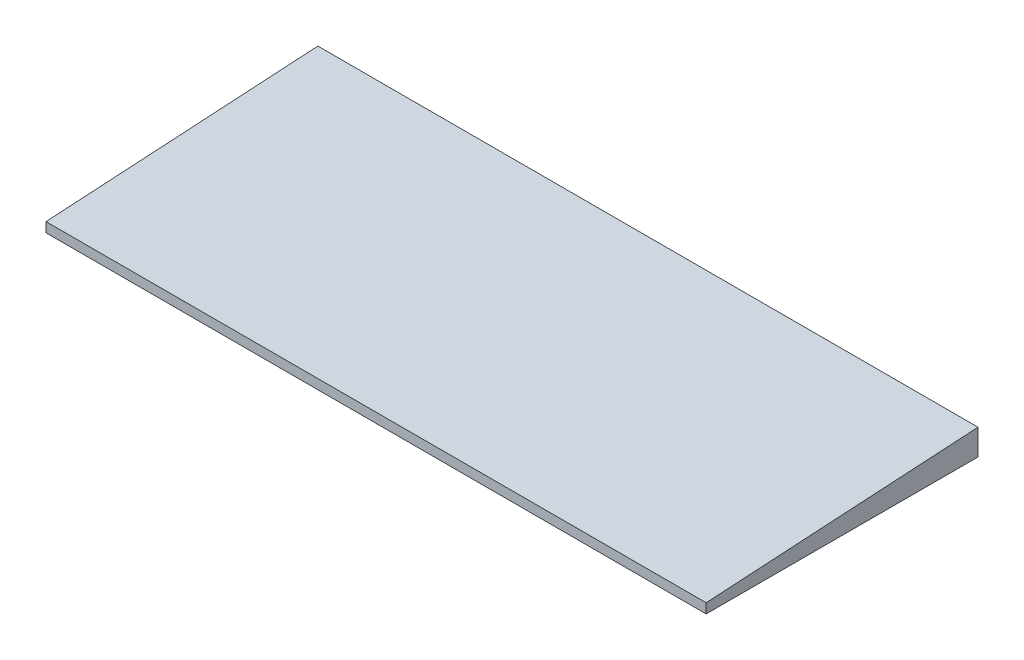
ISO-10303-21;
HEADER;
FILE_DESCRIPTION(('STEP AP214'),'2;1');
FILE_NAME('part.step','',(''),(''),'','','');
FILE_SCHEMA(('AUTOMOTIVE_DESIGN { 1 0 10303 214 1 1 1 1 }'));
ENDSEC;
DATA;
#1=APPLICATION_CONTEXT('core data for automotive mechanical design processes');
#2=APPLICATION_PROTOCOL_DEFINITION('international standard','automotive_design',2000,#1);
#3=PRODUCT_CONTEXT('',#1,'mechanical');
#4=PRODUCT('Part','Part','',(#3));
#5=PRODUCT_RELATED_PRODUCT_CATEGORY('part','',(#4));
#6=PRODUCT_DEFINITION_FORMATION('','',#4);
#7=PRODUCT_DEFINITION_CONTEXT('part definition',#1,'design');
#8=PRODUCT_DEFINITION('design','',#6,#7);
#9=PRODUCT_DEFINITION_SHAPE('','',#8);
#10=(LENGTH_UNIT() NAMED_UNIT(*) SI_UNIT(.MILLI.,.METRE.));
#11=(NAMED_UNIT(*) PLANE_ANGLE_UNIT() SI_UNIT($,.RADIAN.));
#12=(NAMED_UNIT(*) SI_UNIT($,.STERADIAN.) SOLID_ANGLE_UNIT());
#13=UNCERTAINTY_MEASURE_WITH_UNIT(LENGTH_MEASURE(1.E-05),#10,'distance_accuracy_value','');
#14=(GEOMETRIC_REPRESENTATION_CONTEXT(3) GLOBAL_UNCERTAINTY_ASSIGNED_CONTEXT((#13)) GLOBAL_UNIT_ASSIGNED_CONTEXT((#10,
#11,#12)) REPRESENTATION_CONTEXT('',''));
#15=CARTESIAN_POINT('',(0.,0.,0.));
#16=DIRECTION('',(0.,0.,1.));
#17=DIRECTION('',(1.,0.,0.));
#18=AXIS2_PLACEMENT_3D('',#15,#16,#17);
#19=CARTESIAN_POINT('',(279.,4.1,0.));
#20=DIRECTION('',(0.,0.,-1.));
#21=DIRECTION('',(-1.,0.,0.));
#22=AXIS2_PLACEMENT_3D('',#19,#20,#21);
#23=PLANE('',#22);
#24=DIRECTION('',(0.,-1.,0.));
#25=VECTOR('',#24,1.);
#26=CARTESIAN_POINT('',(0.,4.1,0.));
#27=LINE('',#26,#25);
#28=CARTESIAN_POINT('',(0.,4.1,0.));
#29=VERTEX_POINT('',#28);
#30=CARTESIAN_POINT('',(0.,0.,0.));
#31=VERTEX_POINT('',#30);
#32=EDGE_CURVE('E96',#29,#31,#27,.T.);
#33=ORIENTED_EDGE('',*,*,#32,.T.);
#34=DIRECTION('',(-1.,0.,0.));
#35=VECTOR('',#34,1.);
#36=CARTESIAN_POINT('',(279.,0.,0.));
#37=LINE('',#36,#35);
#38=CARTESIAN_POINT('',(279.,0.,0.));
#39=VERTEX_POINT('',#38);
#40=EDGE_CURVE('E11',#39,#31,#37,.T.);
#41=ORIENTED_EDGE('',*,*,#40,.F.);
#42=DIRECTION('',(0.,-1.,0.));
#43=VECTOR('',#42,1.);
#44=CARTESIAN_POINT('',(279.,4.1,0.));
#45=LINE('',#44,#43);
#46=CARTESIAN_POINT('',(279.,4.1,0.));
#47=VERTEX_POINT('',#46);
#48=EDGE_CURVE('E84',#47,#39,#45,.T.);
#49=ORIENTED_EDGE('',*,*,#48,.F.);
#50=DIRECTION('',(-1.,0.,0.));
#51=VECTOR('',#50,1.);
#52=CARTESIAN_POINT('',(279.,4.1,0.));
#53=LINE('',#52,#51);
#54=EDGE_CURVE('E92',#47,#29,#53,.T.);
#55=ORIENTED_EDGE('',*,*,#54,.T.);
#56=EDGE_LOOP('',(#33,#41,#49,#55));
#57=FACE_BOUND('',#56,.T.);
#58=ADVANCED_FACE('F33',(#57),#23,.F.);
#59=CARTESIAN_POINT('',(279.,0.,0.));
#60=DIRECTION('',(0.,1.,0.));
#61=DIRECTION('',(0.,0.,1.));
#62=AXIS2_PLACEMENT_3D('',#59,#60,#61);
#63=PLANE('',#62);
#64=DIRECTION('',(0.,0.,-1.));
#65=VECTOR('',#64,1.);
#66=CARTESIAN_POINT('',(0.,0.,0.));
#67=LINE('',#66,#65);
#68=CARTESIAN_POINT('',(0.,0.,-114.9));
#69=VERTEX_POINT('',#68);
#70=EDGE_CURVE('E88',#31,#69,#67,.T.);
#71=ORIENTED_EDGE('',*,*,#70,.T.);
#72=DIRECTION('',(-1.,0.,0.));
#73=VECTOR('',#72,1.);
#74=CARTESIAN_POINT('',(279.,0.,-114.9));
#75=LINE('',#74,#73);
#76=CARTESIAN_POINT('',(279.,0.,-114.9));
#77=VERTEX_POINT('',#76);
#78=EDGE_CURVE('E41',#77,#69,#75,.T.);
#79=ORIENTED_EDGE('',*,*,#78,.F.);
#80=DIRECTION('',(0.,0.,-1.));
#81=VECTOR('',#80,1.);
#82=CARTESIAN_POINT('',(279.,0.,0.));
#83=LINE('',#82,#81);
#84=EDGE_CURVE('E79',#39,#77,#83,.T.);
#85=ORIENTED_EDGE('',*,*,#84,.F.);
#86=ORIENTED_EDGE('',*,*,#40,.T.);
#87=EDGE_LOOP('',(#71,#79,#85,#86));
#88=FACE_BOUND('',#87,.T.);
#89=ADVANCED_FACE('F87',(#88),#63,.F.);
#90=CARTESIAN_POINT('',(279.,0.,-114.9));
#91=DIRECTION('',(0.,0.,1.));
#92=DIRECTION('',(1.,0.,0.));
#93=AXIS2_PLACEMENT_3D('',#90,#91,#92);
#94=PLANE('',#93);
#95=DIRECTION('',(0.,1.,0.));
#96=VECTOR('',#95,1.);
#97=CARTESIAN_POINT('',(0.,0.,-114.9));
#98=LINE('',#97,#96);
#99=CARTESIAN_POINT('',(0.,10.9,-114.9));
#100=VERTEX_POINT('',#99);
#101=EDGE_CURVE('E66',#69,#100,#98,.T.);
#102=ORIENTED_EDGE('',*,*,#101,.T.);
#103=DIRECTION('',(-1.,0.,0.));
#104=VECTOR('',#103,1.);
#105=CARTESIAN_POINT('',(279.,10.9,-114.9));
#106=LINE('',#105,#104);
#107=CARTESIAN_POINT('',(279.,10.9,-114.9));
#108=VERTEX_POINT('',#107);
#109=EDGE_CURVE('E89',#108,#100,#106,.T.);
#110=ORIENTED_EDGE('',*,*,#109,.F.);
#111=DIRECTION('',(0.,1.,0.));
#112=VECTOR('',#111,1.);
#113=CARTESIAN_POINT('',(279.,0.,-114.9));
#114=LINE('',#113,#112);
#115=EDGE_CURVE('E82',#77,#108,#114,.T.);
#116=ORIENTED_EDGE('',*,*,#115,.F.);
#117=ORIENTED_EDGE('',*,*,#78,.T.);
#118=EDGE_LOOP('',(#102,#110,#116,#117));
#119=FACE_BOUND('',#118,.T.);
#120=ADVANCED_FACE('F90',(#119),#94,.F.);
#121=CARTESIAN_POINT('',(279.,10.9,-114.9));
#122=DIRECTION('',(0.,-0.998253338436634,-0.0590785265567373));
#123=DIRECTION('',(0.,0.0590785265567373,-0.998253338436634));
#124=AXIS2_PLACEMENT_3D('',#121,#122,#123);
#125=PLANE('',#124);
#126=DIRECTION('',(0.,-0.0590785265567373,0.998253338436634));
#127=VECTOR('',#126,1.);
#128=CARTESIAN_POINT('',(0.,10.9,-114.9));
#129=LINE('',#128,#127);
#130=EDGE_CURVE('E72',#100,#29,#129,.T.);
#131=ORIENTED_EDGE('',*,*,#130,.T.);
#132=ORIENTED_EDGE('',*,*,#54,.F.);
#133=DIRECTION('',(0.,-0.0590785265567373,0.998253338436634));
#134=VECTOR('',#133,1.);
#135=CARTESIAN_POINT('',(279.,10.9,-114.9));
#136=LINE('',#135,#134);
#137=EDGE_CURVE('E49',#108,#47,#136,.T.);
#138=ORIENTED_EDGE('',*,*,#137,.F.);
#139=ORIENTED_EDGE('',*,*,#109,.T.);
#140=EDGE_LOOP('',(#131,#132,#138,#139));
#141=FACE_BOUND('',#140,.T.);
#142=ADVANCED_FACE('F103',(#141),#125,.F.);
#143=CARTESIAN_POINT('',(279.,0.,0.));
#144=DIRECTION('',(1.,0.,0.));
#145=DIRECTION('',(0.,0.,-1.));
#146=AXIS2_PLACEMENT_3D('',#143,#144,#145);
#147=PLANE('',#146);
#148=ORIENTED_EDGE('',*,*,#48,.T.);
#149=ORIENTED_EDGE('',*,*,#84,.T.);
#150=ORIENTED_EDGE('',*,*,#115,.T.);
#151=ORIENTED_EDGE('',*,*,#137,.T.);
#152=EDGE_LOOP('',(#148,#149,#150,#151));
#153=FACE_BOUND('',#152,.T.);
#154=ADVANCED_FACE('F80',(#153),#147,.T.);
#155=CARTESIAN_POINT('',(0.,0.,0.));
#156=DIRECTION('',(1.,0.,0.));
#157=DIRECTION('',(0.,0.,-1.));
#158=AXIS2_PLACEMENT_3D('',#155,#156,#157);
#159=PLANE('',#158);
#160=ORIENTED_EDGE('',*,*,#32,.F.);
#161=ORIENTED_EDGE('',*,*,#130,.F.);
#162=ORIENTED_EDGE('',*,*,#101,.F.);
#163=ORIENTED_EDGE('',*,*,#70,.F.);
#164=EDGE_LOOP('',(#160,#161,#162,#163));
#165=FACE_BOUND('',#164,.T.);
#166=ADVANCED_FACE('F106',(#165),#159,.F.);
#167=CLOSED_SHELL('',(#58,#89,#120,#142,#154,#166));
#168=MANIFOLD_SOLID_BREP('B2',#167);
#169=ADVANCED_BREP_SHAPE_REPRESENTATION('',(#18,#168),#14);
#170=SHAPE_DEFINITION_REPRESENTATION(#9,#169);
ENDSEC;
END-ISO-10303-21;
